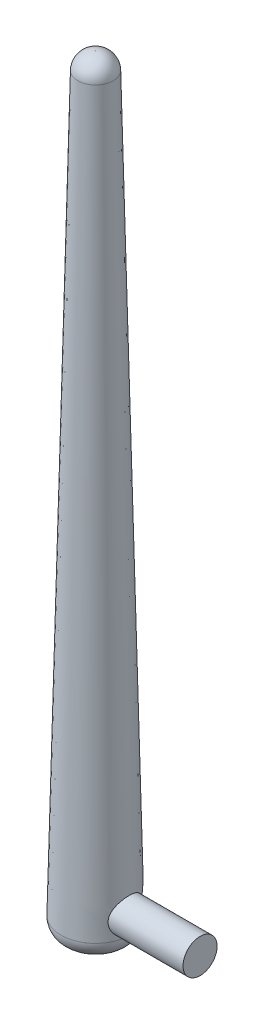
ISO-10303-21;
HEADER;
FILE_DESCRIPTION(('STEP AP214'),'2;1');
FILE_NAME('part.step','',(''),(''),'','','');
FILE_SCHEMA(('AUTOMOTIVE_DESIGN { 1 0 10303 214 1 1 1 1 }'));
ENDSEC;
DATA;
#1=APPLICATION_CONTEXT('core data for automotive mechanical design processes');
#2=APPLICATION_PROTOCOL_DEFINITION('international standard','automotive_design',2000,#1);
#3=PRODUCT_CONTEXT('',#1,'mechanical');
#4=PRODUCT('Part','Part','',(#3));
#5=PRODUCT_RELATED_PRODUCT_CATEGORY('part','',(#4));
#6=PRODUCT_DEFINITION_FORMATION('','',#4);
#7=PRODUCT_DEFINITION_CONTEXT('part definition',#1,'design');
#8=PRODUCT_DEFINITION('design','',#6,#7);
#9=PRODUCT_DEFINITION_SHAPE('','',#8);
#10=(LENGTH_UNIT() NAMED_UNIT(*) SI_UNIT(.MILLI.,.METRE.));
#11=(NAMED_UNIT(*) PLANE_ANGLE_UNIT() SI_UNIT($,.RADIAN.));
#12=(NAMED_UNIT(*) SI_UNIT($,.STERADIAN.) SOLID_ANGLE_UNIT());
#13=UNCERTAINTY_MEASURE_WITH_UNIT(LENGTH_MEASURE(1.E-05),#10,'distance_accuracy_value','');
#14=(GEOMETRIC_REPRESENTATION_CONTEXT(3) GLOBAL_UNCERTAINTY_ASSIGNED_CONTEXT((#13)) GLOBAL_UNIT_ASSIGNED_CONTEXT((#10,
#11,#12)) REPRESENTATION_CONTEXT('',''));
#15=CARTESIAN_POINT('',(0.,0.,0.));
#16=DIRECTION('',(0.,0.,1.));
#17=DIRECTION('',(1.,0.,0.));
#18=AXIS2_PLACEMENT_3D('',#15,#16,#17);
#19=CARTESIAN_POINT('',(0.,0.,0.));
#20=DIRECTION('',(0.,-1.,0.));
#21=DIRECTION('',(0.,0.,-1.));
#22=AXIS2_PLACEMENT_3D('',#19,#20,#21);
#23=CONICAL_SURFACE('',#22,5.,0.0227233608416411);
#24=CARTESIAN_POINT('',(0.,107.556803513383,0.));
#25=DIRECTION('',(0.,1.,0.));
#26=DIRECTION('',(0.,0.,1.));
#27=AXIS2_PLACEMENT_3D('',#24,#25,#26);
#28=CIRCLE('',#27,2.55552719287765);
#29=CARTESIAN_POINT('',(0.,107.556803513383,2.55552719287765));
#30=VERTEX_POINT('',#29);
#31=EDGE_CURVE('E58',#30,#30,#28,.F.);
#32=ORIENTED_EDGE('',*,*,#31,.T.);
#33=EDGE_LOOP('',(#32));
#34=FACE_BOUND('',#33,.T.);
#35=CARTESIAN_POINT('',(0.,2.55680351338325,0.));
#36=DIRECTION('',(0.,1.,0.));
#37=DIRECTION('',(0.,0.,1.));
#38=AXIS2_PLACEMENT_3D('',#35,#36,#37);
#39=CIRCLE('',#38,4.94189082924129);
#40=CARTESIAN_POINT('',(4.94189082924129,2.55680351338325,0.));
#41=VERTEX_POINT('',#40);
#42=EDGE_CURVE('E45',#41,#41,#39,.T.);
#43=ORIENTED_EDGE('',*,*,#42,.T.);
#44=CARTESIAN_POINT('',(4.58894952590176,3.33284829572133,-1.78600511397309));
#45=CARTESIAN_POINT('',(4.62715460090528,3.23429786482421,-1.69400981465468));
#46=CARTESIAN_POINT('',(4.66515191931487,3.14322390345188,-1.5937234203704));
#47=CARTESIAN_POINT('',(4.73714914299398,2.97821716255698,-1.37841670810092));
#48=CARTESIAN_POINT('',(4.77114298574552,2.90431021883966,-1.26337458191497));
#49=CARTESIAN_POINT('',(4.83191509674343,2.77587522310824,-1.02049025203248));
#50=CARTESIAN_POINT('',(4.85866503997386,2.72142298517311,-0.892600407638461));
#51=CARTESIAN_POINT('',(4.90187916159295,2.63477715305707,-0.627912406118634));
#52=CARTESIAN_POINT('',(4.91835468106702,2.60255901229269,-0.491124256004866));
#53=CARTESIAN_POINT('',(4.93832986766872,2.56364752293527,-0.223995014203755));
#54=CARTESIAN_POINT('',(4.94274116623342,2.55515974424272,-0.0939829162554871));
#55=CARTESIAN_POINT('',(4.94076875123292,2.55897279964097,0.165645276496677));
#56=CARTESIAN_POINT('',(4.93438690550877,2.5712700367162,0.295261435932162));
#57=CARTESIAN_POINT('',(4.91215321811582,2.61473233311357,0.542780426443461));
#58=CARTESIAN_POINT('',(4.89685651569911,2.64479267702698,0.660931376169257));
#59=CARTESIAN_POINT('',(4.85861164216483,2.72159251213439,0.89034231874998));
#60=CARTESIAN_POINT('',(4.83566224786242,2.76833466978678,1.00160120662387));
#61=CARTESIAN_POINT('',(4.78255582414997,2.87989987494531,1.2207886772633));
#62=CARTESIAN_POINT('',(4.7520743925532,2.94556880943098,1.32820610733714));
#63=CARTESIAN_POINT('',(4.68718013777064,3.09187791429196,1.53099095495812));
#64=CARTESIAN_POINT('',(4.65276518467352,3.17252621055998,1.62635178471427));
#65=CARTESIAN_POINT('',(4.57904372982094,3.35632882112653,1.8128574450891));
#66=CARTESIAN_POINT('',(4.53960384439161,3.460959018308,1.90249992762429));
#67=CARTESIAN_POINT('',(4.46319312825079,3.68444337667103,2.06336804919901));
#68=CARTESIAN_POINT('',(4.42622363118617,3.8033051256709,2.1345837991462));
#69=CARTESIAN_POINT('',(4.3580126568402,4.0565109617012,2.25819020591306));
#70=CARTESIAN_POINT('',(4.32696188684968,4.19119687693454,2.30999401197454));
#71=CARTESIAN_POINT('',(4.27645665946666,4.46954760695869,2.38928584337139));
#72=CARTESIAN_POINT('',(4.25698465319307,4.61319846735706,2.41681069687766));
#73=CARTESIAN_POINT('',(4.23420035980838,4.88756529283834,2.44404099710935));
#74=CARTESIAN_POINT('',(4.22928677104837,5.01786821136654,2.44658248951996));
#75=CARTESIAN_POINT('',(4.23152785414501,5.27710102297436,2.43089938579167));
#76=CARTESIAN_POINT('',(4.23868047303056,5.40603114586871,2.41267832241081));
#77=CARTESIAN_POINT('',(4.26269840549963,5.64849595799439,2.358579861299));
#78=CARTESIAN_POINT('',(4.2787668123176,5.76244889104559,2.32418256460843));
#79=CARTESIAN_POINT('',(4.31789249197255,5.98312399931323,2.23978627609216));
#80=CARTESIAN_POINT('',(4.34095190726669,6.08984394563157,2.18978250138294));
#81=CARTESIAN_POINT('',(4.39374420624198,6.30297852469632,2.07065628950944));
#82=CARTESIAN_POINT('',(4.42388015272913,6.40857971964658,2.00026067155469));
#83=CARTESIAN_POINT('',(4.48622808120239,6.6073244593945,1.84436652629572));
#84=CARTESIAN_POINT('',(4.51844132457759,6.70046032733216,1.75885876659846));
#85=CARTESIAN_POINT('',(4.58531281849347,6.88196805379098,1.56427646215323));
#86=CARTESIAN_POINT('',(4.61985801901321,6.96873148680709,1.45365252486577));
#87=CARTESIAN_POINT('',(4.6838605560723,7.12254937942997,1.21809917869792));
#88=CARTESIAN_POINT('',(4.71331841285742,7.18960585481719,1.09317123476004));
#89=CARTESIAN_POINT('',(4.76328937857503,7.30048142271631,0.834511329316128));
#90=CARTESIAN_POINT('',(4.7839589744995,7.34471034018963,0.700986867158873));
#91=CARTESIAN_POINT('',(4.81464126752304,7.40966149695426,0.427190771300634));
#92=CARTESIAN_POINT('',(4.82466254426618,7.430402661862,0.286924664928999));
#93=CARTESIAN_POINT('',(4.83242442598916,7.44648903770249,0.017931749683178));
#94=CARTESIAN_POINT('',(4.83123345297308,7.44404354807907,-0.110636662141475));
#95=CARTESIAN_POINT('',(4.81923665254901,7.4191119244026,-0.365341426049784));
#96=CARTESIAN_POINT('',(4.80843162285272,7.39662745305331,-0.491477979026101));
#97=CARTESIAN_POINT('',(4.77873968978609,7.33350257099157,-0.734375689178408));
#98=CARTESIAN_POINT('',(4.76007909947892,7.29336926613232,-0.851298095162035));
#99=CARTESIAN_POINT('',(4.71645095589428,7.19654541506906,-1.07678448859799));
#100=CARTESIAN_POINT('',(4.69148196582844,7.13985109650201,-1.18534656455883));
#101=CARTESIAN_POINT('',(4.63545112528971,7.00689468398741,-1.39949624873816));
#102=CARTESIAN_POINT('',(4.60408062986534,6.92952035809511,-1.5043113760778));
#103=CARTESIAN_POINT('',(4.53956030304207,6.75944588774436,-1.70011748907777));
#104=CARTESIAN_POINT('',(4.50640920339367,6.66673471906451,-1.79109843969914));
#105=CARTESIAN_POINT('',(4.43889617560691,6.45941659545395,-1.96444820780831));
#106=CARTESIAN_POINT('',(4.40466443836272,6.34362751475779,-2.04546270452526));
#107=CARTESIAN_POINT('',(4.34243275258945,6.09852459033505,-2.18688054707344));
#108=CARTESIAN_POINT('',(4.31443063982639,5.96921546662858,-2.24729105483737));
#109=CARTESIAN_POINT('',(4.26986682183687,5.70503173128224,-2.34332538281295));
#110=CARTESIAN_POINT('',(4.25293734386758,5.57051288181169,-2.37974633625229));
#111=CARTESIAN_POINT('',(4.23211402771146,5.29632593390275,-2.42914406457822));
#112=CARTESIAN_POINT('',(4.22820367636004,5.15666458572466,-2.44215052824184));
#113=CARTESIAN_POINT('',(4.23400279567641,4.89462671992578,-2.44400200176732));
#114=CARTESIAN_POINT('',(4.24210741898296,4.77222207125312,-2.43560349154039));
#115=CARTESIAN_POINT('',(4.26815623193139,4.53102394049138,-2.40085907657603));
#116=CARTESIAN_POINT('',(4.2861063163757,4.41223266686658,-2.37450241740998));
#117=CARTESIAN_POINT('',(4.32978269292609,4.18122772423143,-2.30507904032759));
#118=CARTESIAN_POINT('',(4.35550935949113,4.06901437227272,-2.26201151771931));
#119=CARTESIAN_POINT('',(4.41213178762275,3.8532515324288,-2.16064123053326));
#120=CARTESIAN_POINT('',(4.44302283220259,3.74969426664124,-2.10235234163283));
#121=CARTESIAN_POINT('',(4.49361549969081,3.59467145653334,-1.99971604902134));
#122=CARTESIAN_POINT('',(4.51248160966361,3.53979897817405,-1.95999868963639));
#123=CARTESIAN_POINT('',(4.55056572890896,3.4336063855821,-1.87621835282897));
#124=CARTESIAN_POINT('',(4.56978376915501,3.3822865859403,-1.83215499140216));
#125=CARTESIAN_POINT('',(4.58894952590176,3.33284829572133,-1.78600511397309));
#126=B_SPLINE_CURVE_WITH_KNOTS('',3,(#44,#45,#46,#47,#48,#49,#50,#51,#52,#53,#54,#55,#56,#57,
#58,#59,#60,#61,#62,#63,#64,#65,#66,#67,#68,#69,#70,#71,#72,#73,#74,#75,#76,#77,#78,#79,#80,#81,
#82,#83,#84,#85,#86,#87,#88,#89,#90,#91,#92,#93,#94,#95,#96,#97,#98,#99,#100,#101,#102,#103,
#104,#105,#106,#107,#108,#109,#110,#111,#112,#113,#114,#115,#116,#117,#118,#119,#120,#121,#122,
#123,#124,#125),.UNSPECIFIED.,.T.,.F.,(4,2,2,2,2,2,2,2,2,2,2,2,2,2,2,2,2,2,2,2,2,2,2,2,2,2,2,2,
2,2,2,2,2,2,2,2,2,2,2,2,4),(0.,0.420137833610693,0.840903922528561,1.26329227814239,
1.68521356512568,2.07423504647202,2.46318921138867,2.83017845665495,3.19722638859397,
3.5842590574138,3.97150229731018,4.39953872464928,4.82780439247153,5.26813495496552,
5.70779643606532,6.09687986218392,6.48589709546984,6.84472190785141,7.2036567966574,
7.59341928460374,7.98342071673554,8.41566091377792,8.84785688254038,9.27199715839931,
9.69579543301554,10.0796511966687,10.463475113444,10.8369257917106,11.2104616031454,
11.6108022019628,12.0114318286516,12.4455285963405,12.879474318135,13.2981558672316,
13.7163061674377,14.0833948942104,14.450703649418,14.8180300941417,15.1850228488581,
15.3957683443386,15.6065324775943),.UNSPECIFIED.);
#127=EDGE_CURVE('E49',#41,#41,#126,.T.);
#128=ORIENTED_EDGE('',*,*,#127,.T.);
#129=EDGE_LOOP('',(#43,#128));
#130=FACE_BOUND('',#129,.T.);
#131=ADVANCED_FACE('F38',(#34,#130),#23,.T.);
#132=CARTESIAN_POINT('',(0.,0.,0.));
#133=DIRECTION('',(0.,-1.,0.));
#134=DIRECTION('',(0.,0.,-1.));
#135=AXIS2_PLACEMENT_3D('',#132,#133,#134);
#136=PLANE('',#135);
#137=CARTESIAN_POINT('',(0.,0.,0.));
#138=DIRECTION('',(0.,-1.,0.));
#139=DIRECTION('',(0.,0.,-1.));
#140=AXIS2_PLACEMENT_3D('',#137,#138,#139);
#141=CIRCLE('',#140,2.44253624037893);
#142=CARTESIAN_POINT('',(0.,0.,-2.44253624037893));
#143=VERTEX_POINT('',#142);
#144=EDGE_CURVE('E54',#143,#143,#141,.T.);
#145=ORIENTED_EDGE('',*,*,#144,.T.);
#146=EDGE_LOOP('',(#145));
#147=FACE_BOUND('',#146,.T.);
#148=ADVANCED_FACE('F78',(#147),#136,.T.);
#149=CARTESIAN_POINT('',(0.,110.,0.));
#150=DIRECTION('',(0.,1.,0.));
#151=DIRECTION('',(0.,0.,1.));
#152=AXIS2_PLACEMENT_3D('',#149,#150,#151);
#153=PLANE('',#152);
#154=CARTESIAN_POINT('',(0.,110.,0.));
#155=DIRECTION('',(0.,1.,0.));
#156=DIRECTION('',(0.,0.,1.));
#157=AXIS2_PLACEMENT_3D('',#154,#155,#156);
#158=CIRCLE('',#157,0.0561726040152971);
#159=CARTESIAN_POINT('',(0.,110.,0.0561726040152971));
#160=VERTEX_POINT('',#159);
#161=EDGE_CURVE('E11',#160,#160,#158,.T.);
#162=ORIENTED_EDGE('',*,*,#161,.T.);
#163=EDGE_LOOP('',(#162));
#164=FACE_BOUND('',#163,.T.);
#165=ADVANCED_FACE('F75',(#164),#153,.T.);
#166=CARTESIAN_POINT('',(0.,2.5,0.));
#167=DIRECTION('',(0.,-1.,0.));
#168=DIRECTION('',(0.,0.,-1.));
#169=AXIS2_PLACEMENT_3D('',#166,#167,#168);
#170=DEGENERATE_TOROIDAL_SURFACE('',#169,2.44253624037893,2.5,.T.);
#171=ORIENTED_EDGE('',*,*,#42,.F.);
#172=EDGE_LOOP('',(#171));
#173=FACE_BOUND('',#172,.T.);
#174=ORIENTED_EDGE('',*,*,#144,.F.);
#175=EDGE_LOOP('',(#174));
#176=FACE_BOUND('',#175,.T.);
#177=ADVANCED_FACE('F77',(#173,#176),#170,.T.);
#178=CARTESIAN_POINT('',(0.,107.5,0.));
#179=DIRECTION('',(0.,1.,0.));
#180=DIRECTION('',(0.,0.,1.));
#181=AXIS2_PLACEMENT_3D('',#178,#179,#180);
#182=DEGENERATE_TOROIDAL_SURFACE('',#181,0.0561726040152971,2.5,.T.);
#183=ORIENTED_EDGE('',*,*,#161,.F.);
#184=EDGE_LOOP('',(#183));
#185=FACE_BOUND('',#184,.T.);
#186=ORIENTED_EDGE('',*,*,#31,.F.);
#187=EDGE_LOOP('',(#186));
#188=FACE_BOUND('',#187,.T.);
#189=ADVANCED_FACE('F40',(#185,#188),#182,.T.);
#190=CARTESIAN_POINT('',(15.,5.,0.));
#191=DIRECTION('',(-1.,0.,0.));
#192=DIRECTION('',(0.,0.,1.));
#193=AXIS2_PLACEMENT_3D('',#190,#191,#192);
#194=CYLINDRICAL_SURFACE('',#193,2.44319648661675);
#195=ORIENTED_EDGE('',*,*,#127,.F.);
#196=EDGE_LOOP('',(#195));
#197=FACE_BOUND('',#196,.T.);
#198=CARTESIAN_POINT('',(15.,5.,0.));
#199=DIRECTION('',(1.,0.,0.));
#200=DIRECTION('',(0.,0.,-1.));
#201=AXIS2_PLACEMENT_3D('',#198,#199,#200);
#202=CIRCLE('',#201,2.44319648661675);
#203=CARTESIAN_POINT('',(15.,5.,-2.44319648661675));
#204=VERTEX_POINT('',#203);
#205=EDGE_CURVE('E55',#204,#204,#202,.T.);
#206=ORIENTED_EDGE('',*,*,#205,.F.);
#207=EDGE_LOOP('',(#206));
#208=FACE_BOUND('',#207,.T.);
#209=ADVANCED_FACE('F50',(#197,#208),#194,.T.);
#210=CARTESIAN_POINT('',(15.,5.,0.));
#211=DIRECTION('',(1.,0.,0.));
#212=DIRECTION('',(0.,0.,-1.));
#213=AXIS2_PLACEMENT_3D('',#210,#211,#212);
#214=PLANE('',#213);
#215=ORIENTED_EDGE('',*,*,#205,.T.);
#216=EDGE_LOOP('',(#215));
#217=FACE_BOUND('',#216,.T.);
#218=ADVANCED_FACE('F74',(#217),#214,.T.);
#219=CLOSED_SHELL('',(#131,#148,#165,#177,#189,#209,#218));
#220=MANIFOLD_SOLID_BREP('B2',#219);
#221=ADVANCED_BREP_SHAPE_REPRESENTATION('',(#18,#220),#14);
#222=SHAPE_DEFINITION_REPRESENTATION(#9,#221);
ENDSEC;
END-ISO-10303-21;
